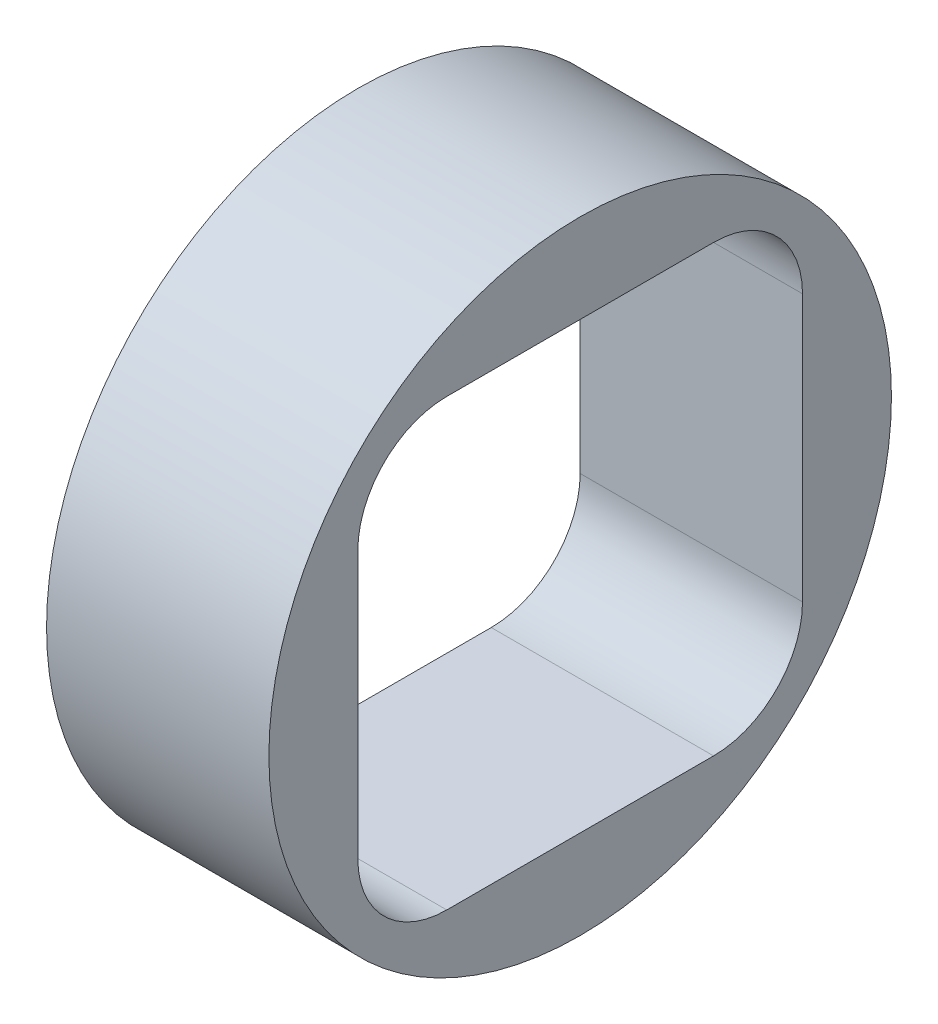
ISO-10303-21;
HEADER;
FILE_DESCRIPTION(('STEP AP214'),'2;1');
FILE_NAME('part.step','',(''),(''),'','','');
FILE_SCHEMA(('AUTOMOTIVE_DESIGN { 1 0 10303 214 1 1 1 1 }'));
ENDSEC;
DATA;
#1=APPLICATION_CONTEXT('core data for automotive mechanical design processes');
#2=APPLICATION_PROTOCOL_DEFINITION('international standard','automotive_design',2000,#1);
#3=PRODUCT_CONTEXT('',#1,'mechanical');
#4=PRODUCT('Part','Part','',(#3));
#5=PRODUCT_RELATED_PRODUCT_CATEGORY('part','',(#4));
#6=PRODUCT_DEFINITION_FORMATION('','',#4);
#7=PRODUCT_DEFINITION_CONTEXT('part definition',#1,'design');
#8=PRODUCT_DEFINITION('design','',#6,#7);
#9=PRODUCT_DEFINITION_SHAPE('','',#8);
#10=(LENGTH_UNIT() NAMED_UNIT(*) SI_UNIT(.MILLI.,.METRE.));
#11=(NAMED_UNIT(*) PLANE_ANGLE_UNIT() SI_UNIT($,.RADIAN.));
#12=(NAMED_UNIT(*) SI_UNIT($,.STERADIAN.) SOLID_ANGLE_UNIT());
#13=UNCERTAINTY_MEASURE_WITH_UNIT(LENGTH_MEASURE(1.E-05),#10,'distance_accuracy_value','');
#14=(GEOMETRIC_REPRESENTATION_CONTEXT(3) GLOBAL_UNCERTAINTY_ASSIGNED_CONTEXT((#13)) GLOBAL_UNIT_ASSIGNED_CONTEXT((#10,
#11,#12)) REPRESENTATION_CONTEXT('',''));
#15=CARTESIAN_POINT('',(0.,0.,0.));
#16=DIRECTION('',(0.,0.,1.));
#17=DIRECTION('',(1.,0.,0.));
#18=AXIS2_PLACEMENT_3D('',#15,#16,#17);
#19=CARTESIAN_POINT('',(3.175,0.,0.));
#20=DIRECTION('',(1.,0.,0.));
#21=DIRECTION('',(0.,0.,-1.));
#22=AXIS2_PLACEMENT_3D('',#19,#20,#21);
#23=PLANE('',#22);
#24=CARTESIAN_POINT('',(3.175,0.,0.));
#25=DIRECTION('',(1.,0.,0.));
#26=DIRECTION('',(0.,0.,-1.));
#27=AXIS2_PLACEMENT_3D('',#24,#25,#26);
#28=CIRCLE('',#27,4.445);
#29=CARTESIAN_POINT('',(3.175,0.,-4.445));
#30=VERTEX_POINT('',#29);
#31=EDGE_CURVE('E11',#30,#30,#28,.T.);
#32=ORIENTED_EDGE('',*,*,#31,.T.);
#33=EDGE_LOOP('',(#32));
#34=FACE_BOUND('',#33,.T.);
#35=DIRECTION('',(0.,0.,1.));
#36=VECTOR('',#35,1.);
#37=CARTESIAN_POINT('',(3.175,3.175,-1.905));
#38=LINE('',#37,#36);
#39=CARTESIAN_POINT('',(3.175,3.175,-1.905));
#40=VERTEX_POINT('',#39);
#41=CARTESIAN_POINT('',(3.175,3.175,1.905));
#42=VERTEX_POINT('',#41);
#43=EDGE_CURVE('E109',#40,#42,#38,.T.);
#44=ORIENTED_EDGE('',*,*,#43,.F.);
#45=CARTESIAN_POINT('',(3.175,1.905,-1.905));
#46=DIRECTION('',(1.,0.,0.));
#47=DIRECTION('',(0.,0.,-1.));
#48=AXIS2_PLACEMENT_3D('',#45,#46,#47);
#49=CIRCLE('',#48,1.27);
#50=CARTESIAN_POINT('',(3.175,1.905,-3.175));
#51=VERTEX_POINT('',#50);
#52=EDGE_CURVE('E101',#51,#40,#49,.T.);
#53=ORIENTED_EDGE('',*,*,#52,.F.);
#54=DIRECTION('',(0.,1.,0.));
#55=VECTOR('',#54,1.);
#56=CARTESIAN_POINT('',(3.175,-1.905,-3.175));
#57=LINE('',#56,#55);
#58=CARTESIAN_POINT('',(3.175,-1.905,-3.175));
#59=VERTEX_POINT('',#58);
#60=EDGE_CURVE('E133',#59,#51,#57,.T.);
#61=ORIENTED_EDGE('',*,*,#60,.F.);
#62=CARTESIAN_POINT('',(3.175,-1.905,-1.905));
#63=DIRECTION('',(1.,0.,0.));
#64=DIRECTION('',(0.,0.,-1.));
#65=AXIS2_PLACEMENT_3D('',#62,#63,#64);
#66=CIRCLE('',#65,1.27);
#67=CARTESIAN_POINT('',(3.175,-3.175,-1.905));
#68=VERTEX_POINT('',#67);
#69=EDGE_CURVE('E131',#68,#59,#66,.T.);
#70=ORIENTED_EDGE('',*,*,#69,.F.);
#71=DIRECTION('',(0.,0.,-1.));
#72=VECTOR('',#71,1.);
#73=CARTESIAN_POINT('',(3.175,-3.175,-1.905));
#74=LINE('',#73,#72);
#75=CARTESIAN_POINT('',(3.175,-3.175,1.905));
#76=VERTEX_POINT('',#75);
#77=EDGE_CURVE('E129',#76,#68,#74,.T.);
#78=ORIENTED_EDGE('',*,*,#77,.F.);
#79=CARTESIAN_POINT('',(3.175,-1.905,1.905));
#80=DIRECTION('',(1.,0.,0.));
#81=DIRECTION('',(0.,0.,-1.));
#82=AXIS2_PLACEMENT_3D('',#79,#80,#81);
#83=CIRCLE('',#82,1.27);
#84=CARTESIAN_POINT('',(3.175,-1.905,3.175));
#85=VERTEX_POINT('',#84);
#86=EDGE_CURVE('E127',#85,#76,#83,.T.);
#87=ORIENTED_EDGE('',*,*,#86,.F.);
#88=DIRECTION('',(0.,-1.,0.));
#89=VECTOR('',#88,1.);
#90=CARTESIAN_POINT('',(3.175,-1.905,3.175));
#91=LINE('',#90,#89);
#92=CARTESIAN_POINT('',(3.175,1.905,3.175));
#93=VERTEX_POINT('',#92);
#94=EDGE_CURVE('E123',#93,#85,#91,.T.);
#95=ORIENTED_EDGE('',*,*,#94,.F.);
#96=CARTESIAN_POINT('',(3.175,1.905,1.905));
#97=DIRECTION('',(1.,0.,0.));
#98=DIRECTION('',(0.,0.,-1.));
#99=AXIS2_PLACEMENT_3D('',#96,#97,#98);
#100=CIRCLE('',#99,1.27);
#101=EDGE_CURVE('E121',#42,#93,#100,.T.);
#102=ORIENTED_EDGE('',*,*,#101,.F.);
#103=EDGE_LOOP('',(#44,#53,#61,#70,#78,#87,#95,#102));
#104=FACE_BOUND('',#103,.T.);
#105=ADVANCED_FACE('F36',(#34,#104),#23,.T.);
#106=CARTESIAN_POINT('',(0.,0.,0.));
#107=DIRECTION('',(1.,0.,0.));
#108=DIRECTION('',(0.,0.,-1.));
#109=AXIS2_PLACEMENT_3D('',#106,#107,#108);
#110=PLANE('',#109);
#111=CARTESIAN_POINT('',(0.,0.,0.));
#112=DIRECTION('',(1.,0.,0.));
#113=DIRECTION('',(0.,0.,-1.));
#114=AXIS2_PLACEMENT_3D('',#111,#112,#113);
#115=CIRCLE('',#114,4.445);
#116=CARTESIAN_POINT('',(0.,0.,-4.445));
#117=VERTEX_POINT('',#116);
#118=EDGE_CURVE('E40',#117,#117,#115,.T.);
#119=ORIENTED_EDGE('',*,*,#118,.F.);
#120=EDGE_LOOP('',(#119));
#121=FACE_BOUND('',#120,.T.);
#122=CARTESIAN_POINT('',(0.,1.905,-1.905));
#123=DIRECTION('',(1.,0.,0.));
#124=DIRECTION('',(0.,0.,-1.));
#125=AXIS2_PLACEMENT_3D('',#122,#123,#124);
#126=CIRCLE('',#125,1.27);
#127=CARTESIAN_POINT('',(0.,1.905,-3.175));
#128=VERTEX_POINT('',#127);
#129=CARTESIAN_POINT('',(0.,3.175,-1.905));
#130=VERTEX_POINT('',#129);
#131=EDGE_CURVE('E59',#128,#130,#126,.T.);
#132=ORIENTED_EDGE('',*,*,#131,.T.);
#133=DIRECTION('',(0.,0.,1.));
#134=VECTOR('',#133,1.);
#135=CARTESIAN_POINT('',(0.,3.175,-1.905));
#136=LINE('',#135,#134);
#137=CARTESIAN_POINT('',(0.,3.175,1.905));
#138=VERTEX_POINT('',#137);
#139=EDGE_CURVE('E116',#130,#138,#136,.T.);
#140=ORIENTED_EDGE('',*,*,#139,.T.);
#141=CARTESIAN_POINT('',(0.,1.905,1.905));
#142=DIRECTION('',(1.,0.,0.));
#143=DIRECTION('',(0.,0.,-1.));
#144=AXIS2_PLACEMENT_3D('',#141,#142,#143);
#145=CIRCLE('',#144,1.27);
#146=CARTESIAN_POINT('',(0.,1.905,3.175));
#147=VERTEX_POINT('',#146);
#148=EDGE_CURVE('E137',#138,#147,#145,.T.);
#149=ORIENTED_EDGE('',*,*,#148,.T.);
#150=DIRECTION('',(0.,-1.,0.));
#151=VECTOR('',#150,1.);
#152=CARTESIAN_POINT('',(0.,-1.905,3.175));
#153=LINE('',#152,#151);
#154=CARTESIAN_POINT('',(0.,-1.905,3.175));
#155=VERTEX_POINT('',#154);
#156=EDGE_CURVE('E140',#147,#155,#153,.T.);
#157=ORIENTED_EDGE('',*,*,#156,.T.);
#158=CARTESIAN_POINT('',(0.,-1.905,1.905));
#159=DIRECTION('',(1.,0.,0.));
#160=DIRECTION('',(0.,0.,-1.));
#161=AXIS2_PLACEMENT_3D('',#158,#159,#160);
#162=CIRCLE('',#161,1.27);
#163=CARTESIAN_POINT('',(0.,-3.175,1.905));
#164=VERTEX_POINT('',#163);
#165=EDGE_CURVE('E143',#155,#164,#162,.T.);
#166=ORIENTED_EDGE('',*,*,#165,.T.);
#167=DIRECTION('',(0.,0.,-1.));
#168=VECTOR('',#167,1.);
#169=CARTESIAN_POINT('',(0.,-3.175,-1.905));
#170=LINE('',#169,#168);
#171=CARTESIAN_POINT('',(0.,-3.175,-1.905));
#172=VERTEX_POINT('',#171);
#173=EDGE_CURVE('E146',#164,#172,#170,.T.);
#174=ORIENTED_EDGE('',*,*,#173,.T.);
#175=CARTESIAN_POINT('',(0.,-1.905,-1.905));
#176=DIRECTION('',(1.,0.,0.));
#177=DIRECTION('',(0.,0.,-1.));
#178=AXIS2_PLACEMENT_3D('',#175,#176,#177);
#179=CIRCLE('',#178,1.27);
#180=CARTESIAN_POINT('',(0.,-1.905,-3.175));
#181=VERTEX_POINT('',#180);
#182=EDGE_CURVE('E149',#172,#181,#179,.T.);
#183=ORIENTED_EDGE('',*,*,#182,.T.);
#184=DIRECTION('',(0.,1.,0.));
#185=VECTOR('',#184,1.);
#186=CARTESIAN_POINT('',(0.,-1.905,-3.175));
#187=LINE('',#186,#185);
#188=EDGE_CURVE('E110',#181,#128,#187,.T.);
#189=ORIENTED_EDGE('',*,*,#188,.T.);
#190=EDGE_LOOP('',(#132,#140,#149,#157,#166,#174,#183,#189));
#191=FACE_BOUND('',#190,.T.);
#192=ADVANCED_FACE('F170',(#121,#191),#110,.F.);
#193=CARTESIAN_POINT('',(3.175,0.,0.));
#194=DIRECTION('',(-1.,0.,0.));
#195=DIRECTION('',(0.,0.,1.));
#196=AXIS2_PLACEMENT_3D('',#193,#194,#195);
#197=CYLINDRICAL_SURFACE('',#196,4.445);
#198=ORIENTED_EDGE('',*,*,#31,.F.);
#199=EDGE_LOOP('',(#198));
#200=FACE_BOUND('',#199,.T.);
#201=ORIENTED_EDGE('',*,*,#118,.T.);
#202=EDGE_LOOP('',(#201));
#203=FACE_BOUND('',#202,.T.);
#204=ADVANCED_FACE('F38',(#200,#203),#197,.T.);
#205=CARTESIAN_POINT('',(3.175,1.905,-1.905));
#206=DIRECTION('',(-1.,0.,0.));
#207=DIRECTION('',(0.,0.,1.));
#208=AXIS2_PLACEMENT_3D('',#205,#206,#207);
#209=CYLINDRICAL_SURFACE('',#208,1.27);
#210=ORIENTED_EDGE('',*,*,#131,.F.);
#211=DIRECTION('',(-1.,0.,0.));
#212=VECTOR('',#211,1.);
#213=CARTESIAN_POINT('',(3.175,1.905,-3.175));
#214=LINE('',#213,#212);
#215=EDGE_CURVE('E105',#51,#128,#214,.T.);
#216=ORIENTED_EDGE('',*,*,#215,.F.);
#217=ORIENTED_EDGE('',*,*,#52,.T.);
#218=DIRECTION('',(-1.,0.,0.));
#219=VECTOR('',#218,1.);
#220=CARTESIAN_POINT('',(3.175,3.175,-1.905));
#221=LINE('',#220,#219);
#222=EDGE_CURVE('E104',#40,#130,#221,.T.);
#223=ORIENTED_EDGE('',*,*,#222,.T.);
#224=EDGE_LOOP('',(#210,#216,#217,#223));
#225=FACE_BOUND('',#224,.T.);
#226=ADVANCED_FACE('F103',(#225),#209,.F.);
#227=CARTESIAN_POINT('',(3.175,3.175,-1.905));
#228=DIRECTION('',(0.,-1.,0.));
#229=DIRECTION('',(0.,0.,-1.));
#230=AXIS2_PLACEMENT_3D('',#227,#228,#229);
#231=PLANE('',#230);
#232=ORIENTED_EDGE('',*,*,#139,.F.);
#233=ORIENTED_EDGE('',*,*,#222,.F.);
#234=ORIENTED_EDGE('',*,*,#43,.T.);
#235=DIRECTION('',(-1.,0.,0.));
#236=VECTOR('',#235,1.);
#237=CARTESIAN_POINT('',(3.175,3.175,1.905));
#238=LINE('',#237,#236);
#239=EDGE_CURVE('E117',#42,#138,#238,.T.);
#240=ORIENTED_EDGE('',*,*,#239,.T.);
#241=EDGE_LOOP('',(#232,#233,#234,#240));
#242=FACE_BOUND('',#241,.T.);
#243=ADVANCED_FACE('F113',(#242),#231,.T.);
#244=CARTESIAN_POINT('',(3.175,1.905,1.905));
#245=DIRECTION('',(-1.,0.,0.));
#246=DIRECTION('',(0.,0.,1.));
#247=AXIS2_PLACEMENT_3D('',#244,#245,#246);
#248=CYLINDRICAL_SURFACE('',#247,1.27);
#249=ORIENTED_EDGE('',*,*,#148,.F.);
#250=ORIENTED_EDGE('',*,*,#239,.F.);
#251=ORIENTED_EDGE('',*,*,#101,.T.);
#252=DIRECTION('',(-1.,0.,0.));
#253=VECTOR('',#252,1.);
#254=CARTESIAN_POINT('',(3.175,1.905,3.175));
#255=LINE('',#254,#253);
#256=EDGE_CURVE('E162',#93,#147,#255,.T.);
#257=ORIENTED_EDGE('',*,*,#256,.T.);
#258=EDGE_LOOP('',(#249,#250,#251,#257));
#259=FACE_BOUND('',#258,.T.);
#260=ADVANCED_FACE('F166',(#259),#248,.F.);
#261=CARTESIAN_POINT('',(3.175,-1.905,3.175));
#262=DIRECTION('',(0.,0.,-1.));
#263=DIRECTION('',(-1.,0.,0.));
#264=AXIS2_PLACEMENT_3D('',#261,#262,#263);
#265=PLANE('',#264);
#266=ORIENTED_EDGE('',*,*,#156,.F.);
#267=ORIENTED_EDGE('',*,*,#256,.F.);
#268=ORIENTED_EDGE('',*,*,#94,.T.);
#269=DIRECTION('',(-1.,0.,0.));
#270=VECTOR('',#269,1.);
#271=CARTESIAN_POINT('',(3.175,-1.905,3.175));
#272=LINE('',#271,#270);
#273=EDGE_CURVE('E160',#85,#155,#272,.T.);
#274=ORIENTED_EDGE('',*,*,#273,.T.);
#275=EDGE_LOOP('',(#266,#267,#268,#274));
#276=FACE_BOUND('',#275,.T.);
#277=ADVANCED_FACE('F188',(#276),#265,.T.);
#278=CARTESIAN_POINT('',(3.175,-1.905,1.905));
#279=DIRECTION('',(-1.,0.,0.));
#280=DIRECTION('',(0.,0.,1.));
#281=AXIS2_PLACEMENT_3D('',#278,#279,#280);
#282=CYLINDRICAL_SURFACE('',#281,1.27);
#283=ORIENTED_EDGE('',*,*,#165,.F.);
#284=ORIENTED_EDGE('',*,*,#273,.F.);
#285=ORIENTED_EDGE('',*,*,#86,.T.);
#286=DIRECTION('',(-1.,0.,0.));
#287=VECTOR('',#286,1.);
#288=CARTESIAN_POINT('',(3.175,-3.175,1.905));
#289=LINE('',#288,#287);
#290=EDGE_CURVE('E158',#76,#164,#289,.T.);
#291=ORIENTED_EDGE('',*,*,#290,.T.);
#292=EDGE_LOOP('',(#283,#284,#285,#291));
#293=FACE_BOUND('',#292,.T.);
#294=ADVANCED_FACE('F185',(#293),#282,.F.);
#295=CARTESIAN_POINT('',(3.175,-3.175,-1.905));
#296=DIRECTION('',(0.,1.,0.));
#297=DIRECTION('',(0.,0.,1.));
#298=AXIS2_PLACEMENT_3D('',#295,#296,#297);
#299=PLANE('',#298);
#300=ORIENTED_EDGE('',*,*,#173,.F.);
#301=ORIENTED_EDGE('',*,*,#290,.F.);
#302=ORIENTED_EDGE('',*,*,#77,.T.);
#303=DIRECTION('',(-1.,0.,0.));
#304=VECTOR('',#303,1.);
#305=CARTESIAN_POINT('',(3.175,-3.175,-1.905));
#306=LINE('',#305,#304);
#307=EDGE_CURVE('E156',#68,#172,#306,.T.);
#308=ORIENTED_EDGE('',*,*,#307,.T.);
#309=EDGE_LOOP('',(#300,#301,#302,#308));
#310=FACE_BOUND('',#309,.T.);
#311=ADVANCED_FACE('F181',(#310),#299,.T.);
#312=CARTESIAN_POINT('',(3.175,-1.905,-1.905));
#313=DIRECTION('',(-1.,0.,0.));
#314=DIRECTION('',(0.,0.,1.));
#315=AXIS2_PLACEMENT_3D('',#312,#313,#314);
#316=CYLINDRICAL_SURFACE('',#315,1.27);
#317=ORIENTED_EDGE('',*,*,#182,.F.);
#318=ORIENTED_EDGE('',*,*,#307,.F.);
#319=ORIENTED_EDGE('',*,*,#69,.T.);
#320=DIRECTION('',(-1.,0.,0.));
#321=VECTOR('',#320,1.);
#322=CARTESIAN_POINT('',(3.175,-1.905,-3.175));
#323=LINE('',#322,#321);
#324=EDGE_CURVE('E51',#59,#181,#323,.T.);
#325=ORIENTED_EDGE('',*,*,#324,.T.);
#326=EDGE_LOOP('',(#317,#318,#319,#325));
#327=FACE_BOUND('',#326,.T.);
#328=ADVANCED_FACE('F178',(#327),#316,.F.);
#329=CARTESIAN_POINT('',(3.175,-1.905,-3.175));
#330=DIRECTION('',(0.,0.,1.));
#331=DIRECTION('',(1.,0.,0.));
#332=AXIS2_PLACEMENT_3D('',#329,#330,#331);
#333=PLANE('',#332);
#334=ORIENTED_EDGE('',*,*,#188,.F.);
#335=ORIENTED_EDGE('',*,*,#324,.F.);
#336=ORIENTED_EDGE('',*,*,#60,.T.);
#337=ORIENTED_EDGE('',*,*,#215,.T.);
#338=EDGE_LOOP('',(#334,#335,#336,#337));
#339=FACE_BOUND('',#338,.T.);
#340=ADVANCED_FACE('F172',(#339),#333,.T.);
#341=CLOSED_SHELL('',(#105,#192,#204,#226,#243,#260,#277,#294,#311,#328,#340));
#342=MANIFOLD_SOLID_BREP('B2',#341);
#343=ADVANCED_BREP_SHAPE_REPRESENTATION('',(#18,#342),#14);
#344=SHAPE_DEFINITION_REPRESENTATION(#9,#343);
ENDSEC;
END-ISO-10303-21;
